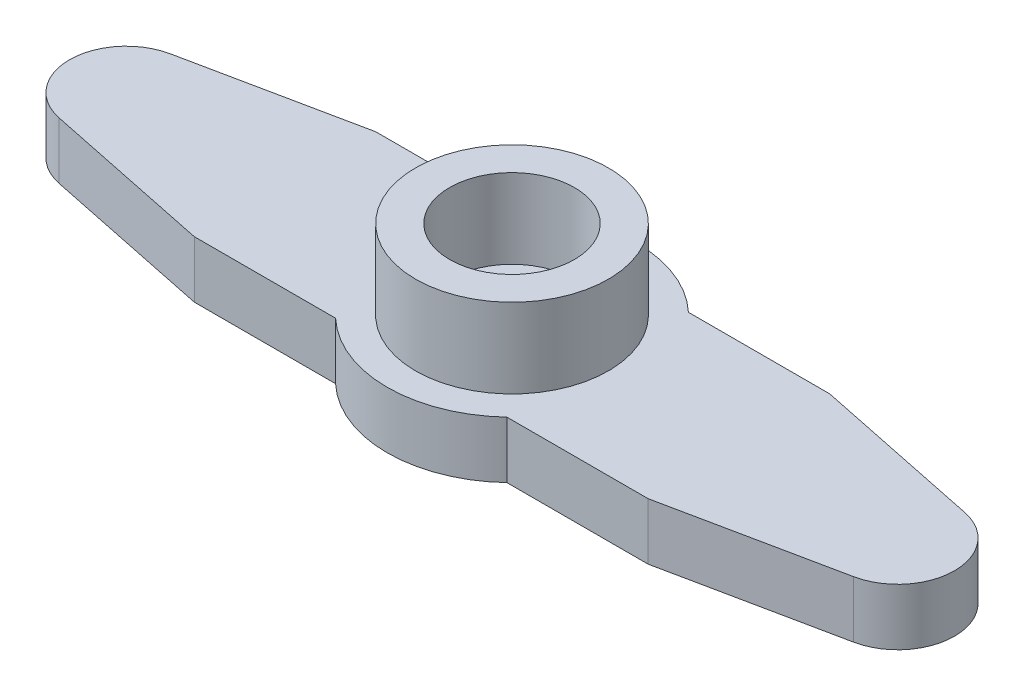
ISO-10303-21;
HEADER;
FILE_DESCRIPTION(('STEP AP214'),'2;1');
FILE_NAME('part.step','',(''),(''),'','','');
FILE_SCHEMA(('AUTOMOTIVE_DESIGN { 1 0 10303 214 1 1 1 1 }'));
ENDSEC;
DATA;
#1=APPLICATION_CONTEXT('core data for automotive mechanical design processes');
#2=APPLICATION_PROTOCOL_DEFINITION('international standard','automotive_design',2000,#1);
#3=PRODUCT_CONTEXT('',#1,'mechanical');
#4=PRODUCT('Part','Part','',(#3));
#5=PRODUCT_RELATED_PRODUCT_CATEGORY('part','',(#4));
#6=PRODUCT_DEFINITION_FORMATION('','',#4);
#7=PRODUCT_DEFINITION_CONTEXT('part definition',#1,'design');
#8=PRODUCT_DEFINITION('design','',#6,#7);
#9=PRODUCT_DEFINITION_SHAPE('','',#8);
#10=(LENGTH_UNIT() NAMED_UNIT(*) SI_UNIT(.MILLI.,.METRE.));
#11=(NAMED_UNIT(*) PLANE_ANGLE_UNIT() SI_UNIT($,.RADIAN.));
#12=(NAMED_UNIT(*) SI_UNIT($,.STERADIAN.) SOLID_ANGLE_UNIT());
#13=UNCERTAINTY_MEASURE_WITH_UNIT(LENGTH_MEASURE(1.E-05),#10,'distance_accuracy_value','');
#14=(GEOMETRIC_REPRESENTATION_CONTEXT(3) GLOBAL_UNCERTAINTY_ASSIGNED_CONTEXT((#13)) GLOBAL_UNIT_ASSIGNED_CONTEXT((#10,
#11,#12)) REPRESENTATION_CONTEXT('',''));
#15=CARTESIAN_POINT('',(0.,0.,0.));
#16=DIRECTION('',(0.,0.,1.));
#17=DIRECTION('',(1.,0.,0.));
#18=AXIS2_PLACEMENT_3D('',#15,#16,#17);
#19=CARTESIAN_POINT('',(0.,0.,0.));
#20=DIRECTION('',(0.,1.,0.));
#21=DIRECTION('',(0.,0.,1.));
#22=AXIS2_PLACEMENT_3D('',#19,#20,#21);
#23=PLANE('',#22);
#24=CARTESIAN_POINT('',(0.,0.,0.));
#25=DIRECTION('',(0.,1.,0.));
#26=DIRECTION('',(0.,0.,1.));
#27=AXIS2_PLACEMENT_3D('',#24,#25,#26);
#28=CIRCLE('',#27,1.5);
#29=CARTESIAN_POINT('',(0.,0.,1.5));
#30=VERTEX_POINT('',#29);
#31=EDGE_CURVE('E174',#30,#30,#28,.T.);
#32=ORIENTED_EDGE('',*,*,#31,.T.);
#33=EDGE_LOOP('',(#32));
#34=FACE_BOUND('',#33,.T.);
#35=CARTESIAN_POINT('',(0.,0.,0.));
#36=DIRECTION('',(0.,-1.,0.));
#37=DIRECTION('',(0.,0.,-1.));
#38=AXIS2_PLACEMENT_3D('',#35,#36,#37);
#39=CIRCLE('',#38,3.25);
#40=CARTESIAN_POINT('',(0.,0.,-3.25));
#41=VERTEX_POINT('',#40);
#42=EDGE_CURVE('E376',#41,#41,#39,.T.);
#43=ORIENTED_EDGE('',*,*,#42,.T.);
#44=EDGE_LOOP('',(#43));
#45=FACE_BOUND('',#44,.T.);
#46=ADVANCED_FACE('F41',(#34,#45),#23,.F.);
#47=CARTESIAN_POINT('',(0.,2.5,0.));
#48=DIRECTION('',(0.,1.,0.));
#49=DIRECTION('',(0.,0.,1.));
#50=AXIS2_PLACEMENT_3D('',#47,#48,#49);
#51=PLANE('',#50);
#52=CARTESIAN_POINT('',(0.,2.5,0.));
#53=DIRECTION('',(0.,1.,0.));
#54=DIRECTION('',(0.,0.,1.));
#55=AXIS2_PLACEMENT_3D('',#52,#53,#54);
#56=CIRCLE('',#55,1.5);
#57=CARTESIAN_POINT('',(0.,2.5,1.5));
#58=VERTEX_POINT('',#57);
#59=EDGE_CURVE('E244',#58,#58,#56,.T.);
#60=ORIENTED_EDGE('',*,*,#59,.F.);
#61=EDGE_LOOP('',(#60));
#62=FACE_BOUND('',#61,.T.);
#63=CARTESIAN_POINT('',(0.,2.5,0.));
#64=DIRECTION('',(0.,1.,0.));
#65=DIRECTION('',(0.,0.,1.));
#66=AXIS2_PLACEMENT_3D('',#63,#64,#65);
#67=CIRCLE('',#66,2.75);
#68=CARTESIAN_POINT('',(0.,2.5,2.75));
#69=VERTEX_POINT('',#68);
#70=EDGE_CURVE('E365',#69,#69,#67,.T.);
#71=ORIENTED_EDGE('',*,*,#70,.T.);
#72=EDGE_LOOP('',(#71));
#73=FACE_BOUND('',#72,.T.);
#74=ADVANCED_FACE('F306',(#62,#73),#51,.T.);
#75=CARTESIAN_POINT('',(-1.20291150177661,2.5,-5.81865407397156));
#76=DIRECTION('',(-0.202452606669412,0.,-0.979292061671471));
#77=DIRECTION('',(-0.979292061671471,0.,0.202452606669412));
#78=AXIS2_PLACEMENT_3D('',#75,#76,#77);
#79=PLANE('',#78);
#80=DIRECTION('',(0.979292061671471,0.,-0.202452606669412));
#81=VECTOR('',#80,1.);
#82=CARTESIAN_POINT('',(-1.20291150177661,0.,-5.81865407397156));
#83=LINE('',#82,#81);
#84=CARTESIAN_POINT('',(-17.5061315166735,0.,-2.44823015417867));
#85=VERTEX_POINT('',#84);
#86=CARTESIAN_POINT('',(-10.,0.,-4.));
#87=VERTEX_POINT('',#86);
#88=EDGE_CURVE('E169',#85,#87,#83,.T.);
#89=ORIENTED_EDGE('',*,*,#88,.F.);
#90=DIRECTION('',(0.,-1.,0.));
#91=VECTOR('',#90,1.);
#92=CARTESIAN_POINT('',(-17.5061315166735,2.5,-2.44823015417867));
#93=LINE('',#92,#91);
#94=CARTESIAN_POINT('',(-17.5061315166735,2.5,-2.44823015417867));
#95=VERTEX_POINT('',#94);
#96=EDGE_CURVE('E111',#95,#85,#93,.T.);
#97=ORIENTED_EDGE('',*,*,#96,.F.);
#98=DIRECTION('',(0.979292061671471,0.,-0.202452606669412));
#99=VECTOR('',#98,1.);
#100=CARTESIAN_POINT('',(-1.20291150177661,2.5,-5.81865407397156));
#101=LINE('',#100,#99);
#102=CARTESIAN_POINT('',(-10.,2.5,-4.));
#103=VERTEX_POINT('',#102);
#104=EDGE_CURVE('E211',#95,#103,#101,.T.);
#105=ORIENTED_EDGE('',*,*,#104,.T.);
#106=DIRECTION('',(0.,-1.,0.));
#107=VECTOR('',#106,1.);
#108=CARTESIAN_POINT('',(-10.,2.5,-4.));
#109=LINE('',#108,#107);
#110=EDGE_CURVE('E106',#103,#87,#109,.T.);
#111=ORIENTED_EDGE('',*,*,#110,.T.);
#112=EDGE_LOOP('',(#89,#97,#105,#111));
#113=FACE_BOUND('',#112,.T.);
#114=ADVANCED_FACE('F43',(#113),#79,.T.);
#115=CARTESIAN_POINT('',(-17.,2.5,0.));
#116=DIRECTION('',(0.,-1.,0.));
#117=DIRECTION('',(0.,0.,-1.));
#118=AXIS2_PLACEMENT_3D('',#115,#116,#117);
#119=CYLINDRICAL_SURFACE('',#118,2.5);
#120=CARTESIAN_POINT('',(-17.,0.,0.));
#121=DIRECTION('',(0.,1.,0.));
#122=DIRECTION('',(0.,0.,1.));
#123=AXIS2_PLACEMENT_3D('',#120,#121,#122);
#124=CIRCLE('',#123,2.5);
#125=CARTESIAN_POINT('',(-17.5061315166735,0.,2.44823015417868));
#126=VERTEX_POINT('',#125);
#127=EDGE_CURVE('E173',#85,#126,#124,.T.);
#128=ORIENTED_EDGE('',*,*,#127,.T.);
#129=DIRECTION('',(0.,-1.,0.));
#130=VECTOR('',#129,1.);
#131=CARTESIAN_POINT('',(-17.5061315166735,2.5,2.44823015417868));
#132=LINE('',#131,#130);
#133=CARTESIAN_POINT('',(-17.5061315166735,2.5,2.44823015417868));
#134=VERTEX_POINT('',#133);
#135=EDGE_CURVE('E237',#134,#126,#132,.T.);
#136=ORIENTED_EDGE('',*,*,#135,.F.);
#137=CARTESIAN_POINT('',(-17.,2.5,0.));
#138=DIRECTION('',(0.,1.,0.));
#139=DIRECTION('',(0.,0.,1.));
#140=AXIS2_PLACEMENT_3D('',#137,#138,#139);
#141=CIRCLE('',#140,2.5);
#142=EDGE_CURVE('E261',#95,#134,#141,.T.);
#143=ORIENTED_EDGE('',*,*,#142,.F.);
#144=ORIENTED_EDGE('',*,*,#96,.T.);
#145=EDGE_LOOP('',(#128,#136,#143,#144));
#146=FACE_BOUND('',#145,.T.);
#147=ADVANCED_FACE('F542',(#146),#119,.T.);
#148=CARTESIAN_POINT('',(-1.2029115017766,2.5,5.81865407397156));
#149=DIRECTION('',(0.202452606669412,0.,-0.979292061671471));
#150=DIRECTION('',(-0.979292061671471,0.,-0.202452606669412));
#151=AXIS2_PLACEMENT_3D('',#148,#149,#150);
#152=PLANE('',#151);
#153=DIRECTION('',(0.979292061671471,0.,0.202452606669412));
#154=VECTOR('',#153,1.);
#155=CARTESIAN_POINT('',(-1.2029115017766,0.,5.81865407397156));
#156=LINE('',#155,#154);
#157=CARTESIAN_POINT('',(-10.,0.,4.));
#158=VERTEX_POINT('',#157);
#159=EDGE_CURVE('E177',#126,#158,#156,.T.);
#160=ORIENTED_EDGE('',*,*,#159,.T.);
#161=DIRECTION('',(0.,-1.,0.));
#162=VECTOR('',#161,1.);
#163=CARTESIAN_POINT('',(-10.,2.5,4.));
#164=LINE('',#163,#162);
#165=CARTESIAN_POINT('',(-10.,2.5,4.));
#166=VERTEX_POINT('',#165);
#167=EDGE_CURVE('E234',#166,#158,#164,.T.);
#168=ORIENTED_EDGE('',*,*,#167,.F.);
#169=DIRECTION('',(0.979292061671471,0.,0.202452606669412));
#170=VECTOR('',#169,1.);
#171=CARTESIAN_POINT('',(-1.2029115017766,2.5,5.81865407397156));
#172=LINE('',#171,#170);
#173=EDGE_CURVE('E264',#134,#166,#172,.T.);
#174=ORIENTED_EDGE('',*,*,#173,.F.);
#175=ORIENTED_EDGE('',*,*,#135,.T.);
#176=EDGE_LOOP('',(#160,#168,#174,#175));
#177=FACE_BOUND('',#176,.T.);
#178=ADVANCED_FACE('F532',(#177),#152,.F.);
#179=CARTESIAN_POINT('',(0.,2.5,4.));
#180=DIRECTION('',(0.,0.,1.));
#181=DIRECTION('',(1.,0.,0.));
#182=AXIS2_PLACEMENT_3D('',#179,#180,#181);
#183=PLANE('',#182);
#184=DIRECTION('',(-1.,0.,0.));
#185=VECTOR('',#184,1.);
#186=CARTESIAN_POINT('',(0.,0.,4.));
#187=LINE('',#186,#185);
#188=CARTESIAN_POINT('',(-3.77491721763537,0.,4.));
#189=VERTEX_POINT('',#188);
#190=EDGE_CURVE('E181',#189,#158,#187,.T.);
#191=ORIENTED_EDGE('',*,*,#190,.F.);
#192=DIRECTION('',(0.,-1.,0.));
#193=VECTOR('',#192,1.);
#194=CARTESIAN_POINT('',(-3.77491721763537,2.5,4.));
#195=LINE('',#194,#193);
#196=CARTESIAN_POINT('',(-3.77491721763537,2.5,4.));
#197=VERTEX_POINT('',#196);
#198=EDGE_CURVE('E231',#197,#189,#195,.T.);
#199=ORIENTED_EDGE('',*,*,#198,.F.);
#200=DIRECTION('',(-1.,0.,0.));
#201=VECTOR('',#200,1.);
#202=CARTESIAN_POINT('',(0.,2.5,4.));
#203=LINE('',#202,#201);
#204=EDGE_CURVE('E267',#197,#166,#203,.T.);
#205=ORIENTED_EDGE('',*,*,#204,.T.);
#206=ORIENTED_EDGE('',*,*,#167,.T.);
#207=EDGE_LOOP('',(#191,#199,#205,#206));
#208=FACE_BOUND('',#207,.T.);
#209=ADVANCED_FACE('F522',(#208),#183,.T.);
#210=CARTESIAN_POINT('',(0.,2.5,0.));
#211=DIRECTION('',(0.,-1.,0.));
#212=DIRECTION('',(0.,0.,-1.));
#213=AXIS2_PLACEMENT_3D('',#210,#211,#212);
#214=CYLINDRICAL_SURFACE('',#213,5.5);
#215=CARTESIAN_POINT('',(0.,0.,0.));
#216=DIRECTION('',(0.,1.,0.));
#217=DIRECTION('',(0.,0.,1.));
#218=AXIS2_PLACEMENT_3D('',#215,#216,#217);
#219=CIRCLE('',#218,5.5);
#220=CARTESIAN_POINT('',(3.77491721763537,0.,4.));
#221=VERTEX_POINT('',#220);
#222=EDGE_CURVE('E185',#189,#221,#219,.T.);
#223=ORIENTED_EDGE('',*,*,#222,.T.);
#224=DIRECTION('',(0.,-1.,0.));
#225=VECTOR('',#224,1.);
#226=CARTESIAN_POINT('',(3.77491721763537,2.5,4.));
#227=LINE('',#226,#225);
#228=CARTESIAN_POINT('',(3.77491721763537,2.5,4.));
#229=VERTEX_POINT('',#228);
#230=EDGE_CURVE('E227',#229,#221,#227,.T.);
#231=ORIENTED_EDGE('',*,*,#230,.F.);
#232=CARTESIAN_POINT('',(0.,2.5,0.));
#233=DIRECTION('',(0.,1.,0.));
#234=DIRECTION('',(0.,0.,1.));
#235=AXIS2_PLACEMENT_3D('',#232,#233,#234);
#236=CIRCLE('',#235,5.5);
#237=EDGE_CURVE('E271',#197,#229,#236,.T.);
#238=ORIENTED_EDGE('',*,*,#237,.F.);
#239=ORIENTED_EDGE('',*,*,#198,.T.);
#240=EDGE_LOOP('',(#223,#231,#238,#239));
#241=FACE_BOUND('',#240,.T.);
#242=ADVANCED_FACE('F512',(#241),#214,.T.);
#243=CARTESIAN_POINT('',(0.,2.5,4.));
#244=DIRECTION('',(0.,0.,-1.));
#245=DIRECTION('',(-1.,0.,0.));
#246=AXIS2_PLACEMENT_3D('',#243,#244,#245);
#247=PLANE('',#246);
#248=DIRECTION('',(1.,0.,0.));
#249=VECTOR('',#248,1.);
#250=CARTESIAN_POINT('',(0.,0.,4.));
#251=LINE('',#250,#249);
#252=CARTESIAN_POINT('',(10.,0.,4.));
#253=VERTEX_POINT('',#252);
#254=EDGE_CURVE('E188',#221,#253,#251,.T.);
#255=ORIENTED_EDGE('',*,*,#254,.T.);
#256=DIRECTION('',(0.,-1.,0.));
#257=VECTOR('',#256,1.);
#258=CARTESIAN_POINT('',(10.,2.5,4.));
#259=LINE('',#258,#257);
#260=CARTESIAN_POINT('',(10.,2.5,4.));
#261=VERTEX_POINT('',#260);
#262=EDGE_CURVE('E224',#261,#253,#259,.T.);
#263=ORIENTED_EDGE('',*,*,#262,.F.);
#264=DIRECTION('',(1.,0.,0.));
#265=VECTOR('',#264,1.);
#266=CARTESIAN_POINT('',(0.,2.5,4.));
#267=LINE('',#266,#265);
#268=EDGE_CURVE('E274',#229,#261,#267,.T.);
#269=ORIENTED_EDGE('',*,*,#268,.F.);
#270=ORIENTED_EDGE('',*,*,#230,.T.);
#271=EDGE_LOOP('',(#255,#263,#269,#270));
#272=FACE_BOUND('',#271,.T.);
#273=ADVANCED_FACE('F503',(#272),#247,.F.);
#274=CARTESIAN_POINT('',(1.2029115017766,2.5,5.81865407397156));
#275=DIRECTION('',(0.202452606669412,0.,0.979292061671471));
#276=DIRECTION('',(0.979292061671471,0.,-0.202452606669412));
#277=AXIS2_PLACEMENT_3D('',#274,#275,#276);
#278=PLANE('',#277);
#279=DIRECTION('',(-0.979292061671471,0.,0.202452606669412));
#280=VECTOR('',#279,1.);
#281=CARTESIAN_POINT('',(1.2029115017766,0.,5.81865407397156));
#282=LINE('',#281,#280);
#283=CARTESIAN_POINT('',(17.5061315166735,0.,2.44823015417868));
#284=VERTEX_POINT('',#283);
#285=EDGE_CURVE('E192',#284,#253,#282,.T.);
#286=ORIENTED_EDGE('',*,*,#285,.F.);
#287=DIRECTION('',(0.,-1.,0.));
#288=VECTOR('',#287,1.);
#289=CARTESIAN_POINT('',(17.5061315166735,2.5,2.44823015417868));
#290=LINE('',#289,#288);
#291=CARTESIAN_POINT('',(17.5061315166735,2.5,2.44823015417868));
#292=VERTEX_POINT('',#291);
#293=EDGE_CURVE('E221',#292,#284,#290,.T.);
#294=ORIENTED_EDGE('',*,*,#293,.F.);
#295=DIRECTION('',(-0.979292061671471,0.,0.202452606669412));
#296=VECTOR('',#295,1.);
#297=CARTESIAN_POINT('',(1.2029115017766,2.5,5.81865407397156));
#298=LINE('',#297,#296);
#299=EDGE_CURVE('E277',#292,#261,#298,.T.);
#300=ORIENTED_EDGE('',*,*,#299,.T.);
#301=ORIENTED_EDGE('',*,*,#262,.T.);
#302=EDGE_LOOP('',(#286,#294,#300,#301));
#303=FACE_BOUND('',#302,.T.);
#304=ADVANCED_FACE('F290',(#303),#278,.T.);
#305=CARTESIAN_POINT('',(17.,2.5,0.));
#306=DIRECTION('',(0.,-1.,0.));
#307=DIRECTION('',(0.,0.,-1.));
#308=AXIS2_PLACEMENT_3D('',#305,#306,#307);
#309=CYLINDRICAL_SURFACE('',#308,2.5);
#310=CARTESIAN_POINT('',(17.,0.,0.));
#311=DIRECTION('',(0.,1.,0.));
#312=DIRECTION('',(0.,0.,1.));
#313=AXIS2_PLACEMENT_3D('',#310,#311,#312);
#314=CIRCLE('',#313,2.5);
#315=CARTESIAN_POINT('',(17.5061315166735,0.,-2.44823015417868));
#316=VERTEX_POINT('',#315);
#317=EDGE_CURVE('E196',#316,#284,#314,.F.);
#318=ORIENTED_EDGE('',*,*,#317,.F.);
#319=DIRECTION('',(0.,-1.,0.));
#320=VECTOR('',#319,1.);
#321=CARTESIAN_POINT('',(17.5061315166735,2.5,-2.44823015417868));
#322=LINE('',#321,#320);
#323=CARTESIAN_POINT('',(17.5061315166735,2.5,-2.44823015417868));
#324=VERTEX_POINT('',#323);
#325=EDGE_CURVE('E218',#324,#316,#322,.T.);
#326=ORIENTED_EDGE('',*,*,#325,.F.);
#327=CARTESIAN_POINT('',(17.,2.5,0.));
#328=DIRECTION('',(0.,1.,0.));
#329=DIRECTION('',(0.,0.,1.));
#330=AXIS2_PLACEMENT_3D('',#327,#328,#329);
#331=CIRCLE('',#330,2.5);
#332=EDGE_CURVE('E163',#324,#292,#331,.F.);
#333=ORIENTED_EDGE('',*,*,#332,.T.);
#334=ORIENTED_EDGE('',*,*,#293,.T.);
#335=EDGE_LOOP('',(#318,#326,#333,#334));
#336=FACE_BOUND('',#335,.T.);
#337=ADVANCED_FACE('F284',(#336),#309,.T.);
#338=CARTESIAN_POINT('',(1.2029115017766,2.5,-5.81865407397156));
#339=DIRECTION('',(-0.202452606669412,0.,0.979292061671471));
#340=DIRECTION('',(0.979292061671471,0.,0.202452606669412));
#341=AXIS2_PLACEMENT_3D('',#338,#339,#340);
#342=PLANE('',#341);
#343=DIRECTION('',(-0.979292061671471,0.,-0.202452606669412));
#344=VECTOR('',#343,1.);
#345=CARTESIAN_POINT('',(1.2029115017766,0.,-5.81865407397156));
#346=LINE('',#345,#344);
#347=CARTESIAN_POINT('',(10.,0.,-4.));
#348=VERTEX_POINT('',#347);
#349=EDGE_CURVE('E200',#316,#348,#346,.T.);
#350=ORIENTED_EDGE('',*,*,#349,.T.);
#351=DIRECTION('',(0.,-1.,0.));
#352=VECTOR('',#351,1.);
#353=CARTESIAN_POINT('',(10.,2.5,-4.));
#354=LINE('',#353,#352);
#355=CARTESIAN_POINT('',(10.,2.5,-4.));
#356=VERTEX_POINT('',#355);
#357=EDGE_CURVE('E148',#356,#348,#354,.T.);
#358=ORIENTED_EDGE('',*,*,#357,.F.);
#359=DIRECTION('',(-0.979292061671471,0.,-0.202452606669412));
#360=VECTOR('',#359,1.);
#361=CARTESIAN_POINT('',(1.2029115017766,2.5,-5.81865407397156));
#362=LINE('',#361,#360);
#363=EDGE_CURVE('E158',#324,#356,#362,.T.);
#364=ORIENTED_EDGE('',*,*,#363,.F.);
#365=ORIENTED_EDGE('',*,*,#325,.T.);
#366=EDGE_LOOP('',(#350,#358,#364,#365));
#367=FACE_BOUND('',#366,.T.);
#368=ADVANCED_FACE('F296',(#367),#342,.F.);
#369=CARTESIAN_POINT('',(0.,2.5,-4.));
#370=DIRECTION('',(0.,0.,-1.));
#371=DIRECTION('',(-1.,0.,0.));
#372=AXIS2_PLACEMENT_3D('',#369,#370,#371);
#373=PLANE('',#372);
#374=DIRECTION('',(1.,0.,0.));
#375=VECTOR('',#374,1.);
#376=CARTESIAN_POINT('',(0.,0.,-4.));
#377=LINE('',#376,#375);
#378=CARTESIAN_POINT('',(3.77491721763537,0.,-4.));
#379=VERTEX_POINT('',#378);
#380=EDGE_CURVE('E146',#379,#348,#377,.T.);
#381=ORIENTED_EDGE('',*,*,#380,.F.);
#382=DIRECTION('',(0.,-1.,0.));
#383=VECTOR('',#382,1.);
#384=CARTESIAN_POINT('',(3.77491721763537,2.5,-4.));
#385=LINE('',#384,#383);
#386=CARTESIAN_POINT('',(3.77491721763537,2.5,-4.));
#387=VERTEX_POINT('',#386);
#388=EDGE_CURVE('E140',#387,#379,#385,.T.);
#389=ORIENTED_EDGE('',*,*,#388,.F.);
#390=DIRECTION('',(1.,0.,0.));
#391=VECTOR('',#390,1.);
#392=CARTESIAN_POINT('',(0.,2.5,-4.));
#393=LINE('',#392,#391);
#394=EDGE_CURVE('E144',#387,#356,#393,.T.);
#395=ORIENTED_EDGE('',*,*,#394,.T.);
#396=ORIENTED_EDGE('',*,*,#357,.T.);
#397=EDGE_LOOP('',(#381,#389,#395,#396));
#398=FACE_BOUND('',#397,.T.);
#399=ADVANCED_FACE('F142',(#398),#373,.T.);
#400=CARTESIAN_POINT('',(0.,2.5,0.));
#401=DIRECTION('',(0.,-1.,0.));
#402=DIRECTION('',(0.,0.,-1.));
#403=AXIS2_PLACEMENT_3D('',#400,#401,#402);
#404=CYLINDRICAL_SURFACE('',#403,5.5);
#405=CARTESIAN_POINT('',(0.,0.,0.));
#406=DIRECTION('',(0.,1.,0.));
#407=DIRECTION('',(0.,0.,1.));
#408=AXIS2_PLACEMENT_3D('',#405,#406,#407);
#409=CIRCLE('',#408,5.5);
#410=CARTESIAN_POINT('',(-3.77491721763537,0.,-4.));
#411=VERTEX_POINT('',#410);
#412=EDGE_CURVE('E99',#379,#411,#409,.T.);
#413=ORIENTED_EDGE('',*,*,#412,.T.);
#414=DIRECTION('',(0.,-1.,0.));
#415=VECTOR('',#414,1.);
#416=CARTESIAN_POINT('',(-3.77491721763537,2.5,-4.));
#417=LINE('',#416,#415);
#418=CARTESIAN_POINT('',(-3.77491721763537,2.5,-4.));
#419=VERTEX_POINT('',#418);
#420=EDGE_CURVE('E149',#419,#411,#417,.T.);
#421=ORIENTED_EDGE('',*,*,#420,.F.);
#422=CARTESIAN_POINT('',(0.,2.5,0.));
#423=DIRECTION('',(0.,1.,0.));
#424=DIRECTION('',(0.,0.,1.));
#425=AXIS2_PLACEMENT_3D('',#422,#423,#424);
#426=CIRCLE('',#425,5.5);
#427=EDGE_CURVE('E151',#387,#419,#426,.T.);
#428=ORIENTED_EDGE('',*,*,#427,.F.);
#429=ORIENTED_EDGE('',*,*,#388,.T.);
#430=EDGE_LOOP('',(#413,#421,#428,#429));
#431=FACE_BOUND('',#430,.T.);
#432=ADVANCED_FACE('F152',(#431),#404,.T.);
#433=CARTESIAN_POINT('',(0.,2.5,-4.));
#434=DIRECTION('',(0.,0.,1.));
#435=DIRECTION('',(1.,0.,0.));
#436=AXIS2_PLACEMENT_3D('',#433,#434,#435);
#437=PLANE('',#436);
#438=DIRECTION('',(-1.,0.,0.));
#439=VECTOR('',#438,1.);
#440=CARTESIAN_POINT('',(0.,0.,-4.));
#441=LINE('',#440,#439);
#442=EDGE_CURVE('E208',#411,#87,#441,.T.);
#443=ORIENTED_EDGE('',*,*,#442,.T.);
#444=ORIENTED_EDGE('',*,*,#110,.F.);
#445=DIRECTION('',(-1.,0.,0.));
#446=VECTOR('',#445,1.);
#447=CARTESIAN_POINT('',(0.,2.5,-4.));
#448=LINE('',#447,#446);
#449=EDGE_CURVE('E59',#419,#103,#448,.T.);
#450=ORIENTED_EDGE('',*,*,#449,.F.);
#451=ORIENTED_EDGE('',*,*,#420,.T.);
#452=EDGE_LOOP('',(#443,#444,#450,#451));
#453=FACE_BOUND('',#452,.T.);
#454=ADVANCED_FACE('F324',(#453),#437,.F.);
#455=CARTESIAN_POINT('',(0.,2.5,0.));
#456=DIRECTION('',(0.,1.,0.));
#457=DIRECTION('',(0.,0.,1.));
#458=AXIS2_PLACEMENT_3D('',#455,#456,#457);
#459=CIRCLE('',#458,4.25);
#460=CARTESIAN_POINT('',(0.,2.5,4.25));
#461=VERTEX_POINT('',#460);
#462=EDGE_CURVE('E51',#461,#461,#459,.T.);
#463=ORIENTED_EDGE('',*,*,#462,.F.);
#464=EDGE_LOOP('',(#463));
#465=FACE_BOUND('',#464,.T.);
#466=ORIENTED_EDGE('',*,*,#104,.F.);
#467=ORIENTED_EDGE('',*,*,#142,.T.);
#468=ORIENTED_EDGE('',*,*,#173,.T.);
#469=ORIENTED_EDGE('',*,*,#204,.F.);
#470=ORIENTED_EDGE('',*,*,#237,.T.);
#471=ORIENTED_EDGE('',*,*,#268,.T.);
#472=ORIENTED_EDGE('',*,*,#299,.F.);
#473=ORIENTED_EDGE('',*,*,#332,.F.);
#474=ORIENTED_EDGE('',*,*,#363,.T.);
#475=ORIENTED_EDGE('',*,*,#394,.F.);
#476=ORIENTED_EDGE('',*,*,#427,.T.);
#477=ORIENTED_EDGE('',*,*,#449,.T.);
#478=EDGE_LOOP('',(#466,#467,#468,#469,#470,#471,#472,#473,#474,#475,#476,#477));
#479=FACE_BOUND('',#478,.T.);
#480=ADVANCED_FACE('F155',(#465,#479),#51,.T.);
#481=CARTESIAN_POINT('',(0.,0.,0.));
#482=DIRECTION('',(0.,1.,0.));
#483=DIRECTION('',(0.,0.,1.));
#484=AXIS2_PLACEMENT_3D('',#481,#482,#483);
#485=CIRCLE('',#484,3.75);
#486=CARTESIAN_POINT('',(0.,0.,3.75));
#487=VERTEX_POINT('',#486);
#488=EDGE_CURVE('E11',#487,#487,#485,.F.);
#489=ORIENTED_EDGE('',*,*,#488,.F.);
#490=EDGE_LOOP('',(#489));
#491=FACE_BOUND('',#490,.T.);
#492=ORIENTED_EDGE('',*,*,#88,.T.);
#493=ORIENTED_EDGE('',*,*,#442,.F.);
#494=ORIENTED_EDGE('',*,*,#412,.F.);
#495=ORIENTED_EDGE('',*,*,#380,.T.);
#496=ORIENTED_EDGE('',*,*,#349,.F.);
#497=ORIENTED_EDGE('',*,*,#317,.T.);
#498=ORIENTED_EDGE('',*,*,#285,.T.);
#499=ORIENTED_EDGE('',*,*,#254,.F.);
#500=ORIENTED_EDGE('',*,*,#222,.F.);
#501=ORIENTED_EDGE('',*,*,#190,.T.);
#502=ORIENTED_EDGE('',*,*,#159,.F.);
#503=ORIENTED_EDGE('',*,*,#127,.F.);
#504=EDGE_LOOP('',(#492,#493,#494,#495,#496,#497,#498,#499,#500,#501,#502,#503));
#505=FACE_BOUND('',#504,.T.);
#506=ADVANCED_FACE('F294',(#491,#505),#23,.F.);
#507=CARTESIAN_POINT('',(0.,-7.5,0.));
#508=DIRECTION('',(0.,1.,0.));
#509=DIRECTION('',(0.,0.,1.));
#510=AXIS2_PLACEMENT_3D('',#507,#508,#509);
#511=CYLINDRICAL_SURFACE('',#510,1.5);
#512=ORIENTED_EDGE('',*,*,#59,.T.);
#513=EDGE_LOOP('',(#512));
#514=FACE_BOUND('',#513,.T.);
#515=ORIENTED_EDGE('',*,*,#31,.F.);
#516=EDGE_LOOP('',(#515));
#517=FACE_BOUND('',#516,.T.);
#518=ADVANCED_FACE('F316',(#514,#517),#511,.F.);
#519=CARTESIAN_POINT('',(0.,6.,0.));
#520=DIRECTION('',(0.,1.,0.));
#521=DIRECTION('',(0.,0.,1.));
#522=AXIS2_PLACEMENT_3D('',#519,#520,#521);
#523=PLANE('',#522);
#524=CARTESIAN_POINT('',(0.,6.,0.));
#525=DIRECTION('',(0.,1.,0.));
#526=DIRECTION('',(0.,0.,1.));
#527=AXIS2_PLACEMENT_3D('',#524,#525,#526);
#528=CIRCLE('',#527,4.25);
#529=CARTESIAN_POINT('',(0.,6.,4.25));
#530=VERTEX_POINT('',#529);
#531=EDGE_CURVE('E249',#530,#530,#528,.T.);
#532=ORIENTED_EDGE('',*,*,#531,.T.);
#533=EDGE_LOOP('',(#532));
#534=FACE_BOUND('',#533,.T.);
#535=CARTESIAN_POINT('',(0.,6.,0.));
#536=DIRECTION('',(0.,1.,0.));
#537=DIRECTION('',(0.,0.,1.));
#538=AXIS2_PLACEMENT_3D('',#535,#536,#537);
#539=CIRCLE('',#538,2.75);
#540=CARTESIAN_POINT('',(0.,6.,2.75));
#541=VERTEX_POINT('',#540);
#542=EDGE_CURVE('E255',#541,#541,#539,.T.);
#543=ORIENTED_EDGE('',*,*,#542,.F.);
#544=EDGE_LOOP('',(#543));
#545=FACE_BOUND('',#544,.T.);
#546=ADVANCED_FACE('F322',(#534,#545),#523,.T.);
#547=CARTESIAN_POINT('',(0.,6.,0.));
#548=DIRECTION('',(0.,-1.,0.));
#549=DIRECTION('',(0.,0.,-1.));
#550=AXIS2_PLACEMENT_3D('',#547,#548,#549);
#551=CYLINDRICAL_SURFACE('',#550,4.25);
#552=ORIENTED_EDGE('',*,*,#531,.F.);
#553=EDGE_LOOP('',(#552));
#554=FACE_BOUND('',#553,.T.);
#555=ORIENTED_EDGE('',*,*,#462,.T.);
#556=EDGE_LOOP('',(#555));
#557=FACE_BOUND('',#556,.T.);
#558=ADVANCED_FACE('F347',(#554,#557),#551,.T.);
#559=CARTESIAN_POINT('',(0.,6.,0.));
#560=DIRECTION('',(0.,-1.,0.));
#561=DIRECTION('',(0.,0.,-1.));
#562=AXIS2_PLACEMENT_3D('',#559,#560,#561);
#563=CYLINDRICAL_SURFACE('',#562,2.75);
#564=ORIENTED_EDGE('',*,*,#542,.T.);
#565=EDGE_LOOP('',(#564));
#566=FACE_BOUND('',#565,.T.);
#567=ORIENTED_EDGE('',*,*,#70,.F.);
#568=EDGE_LOOP('',(#567));
#569=FACE_BOUND('',#568,.T.);
#570=ADVANCED_FACE('F340',(#566,#569),#563,.F.);
#571=CARTESIAN_POINT('',(0.,-0.5,0.));
#572=DIRECTION('',(0.,-1.,0.));
#573=DIRECTION('',(0.,0.,-1.));
#574=AXIS2_PLACEMENT_3D('',#571,#572,#573);
#575=PLANE('',#574);
#576=CARTESIAN_POINT('',(0.,-0.5,0.));
#577=DIRECTION('',(0.,-1.,0.));
#578=DIRECTION('',(0.,0.,-1.));
#579=AXIS2_PLACEMENT_3D('',#576,#577,#578);
#580=CIRCLE('',#579,3.75);
#581=CARTESIAN_POINT('',(0.,-0.5,-3.75));
#582=VERTEX_POINT('',#581);
#583=EDGE_CURVE('E369',#582,#582,#580,.T.);
#584=ORIENTED_EDGE('',*,*,#583,.T.);
#585=EDGE_LOOP('',(#584));
#586=FACE_BOUND('',#585,.T.);
#587=CARTESIAN_POINT('',(0.,-0.5,0.));
#588=DIRECTION('',(0.,-1.,0.));
#589=DIRECTION('',(0.,0.,-1.));
#590=AXIS2_PLACEMENT_3D('',#587,#588,#589);
#591=CIRCLE('',#590,3.25);
#592=CARTESIAN_POINT('',(0.,-0.5,-3.25));
#593=VERTEX_POINT('',#592);
#594=EDGE_CURVE('E375',#593,#593,#591,.T.);
#595=ORIENTED_EDGE('',*,*,#594,.F.);
#596=EDGE_LOOP('',(#595));
#597=FACE_BOUND('',#596,.T.);
#598=ADVANCED_FACE('F331',(#586,#597),#575,.T.);
#599=CARTESIAN_POINT('',(0.,-0.5,0.));
#600=DIRECTION('',(0.,1.,0.));
#601=DIRECTION('',(0.,0.,1.));
#602=AXIS2_PLACEMENT_3D('',#599,#600,#601);
#603=CYLINDRICAL_SURFACE('',#602,3.75);
#604=ORIENTED_EDGE('',*,*,#583,.F.);
#605=EDGE_LOOP('',(#604));
#606=FACE_BOUND('',#605,.T.);
#607=ORIENTED_EDGE('',*,*,#488,.T.);
#608=EDGE_LOOP('',(#607));
#609=FACE_BOUND('',#608,.T.);
#610=ADVANCED_FACE('F328',(#606,#609),#603,.T.);
#611=CARTESIAN_POINT('',(0.,-0.5,0.));
#612=DIRECTION('',(0.,1.,0.));
#613=DIRECTION('',(0.,0.,1.));
#614=AXIS2_PLACEMENT_3D('',#611,#612,#613);
#615=CYLINDRICAL_SURFACE('',#614,3.25);
#616=ORIENTED_EDGE('',*,*,#594,.T.);
#617=EDGE_LOOP('',(#616));
#618=FACE_BOUND('',#617,.T.);
#619=ORIENTED_EDGE('',*,*,#42,.F.);
#620=EDGE_LOOP('',(#619));
#621=FACE_BOUND('',#620,.T.);
#622=ADVANCED_FACE('F330',(#618,#621),#615,.F.);
#623=CLOSED_SHELL('',(#46,#74,#114,#147,#178,#209,#242,#273,#304,#337,#368,#399,#432,#454,#480,
#506,#518,#546,#558,#570,#598,#610,#622));
#624=MANIFOLD_SOLID_BREP('B2',#623);
#625=ADVANCED_BREP_SHAPE_REPRESENTATION('',(#18,#624),#14);
#626=SHAPE_DEFINITION_REPRESENTATION(#9,#625);
ENDSEC;
END-ISO-10303-21;
